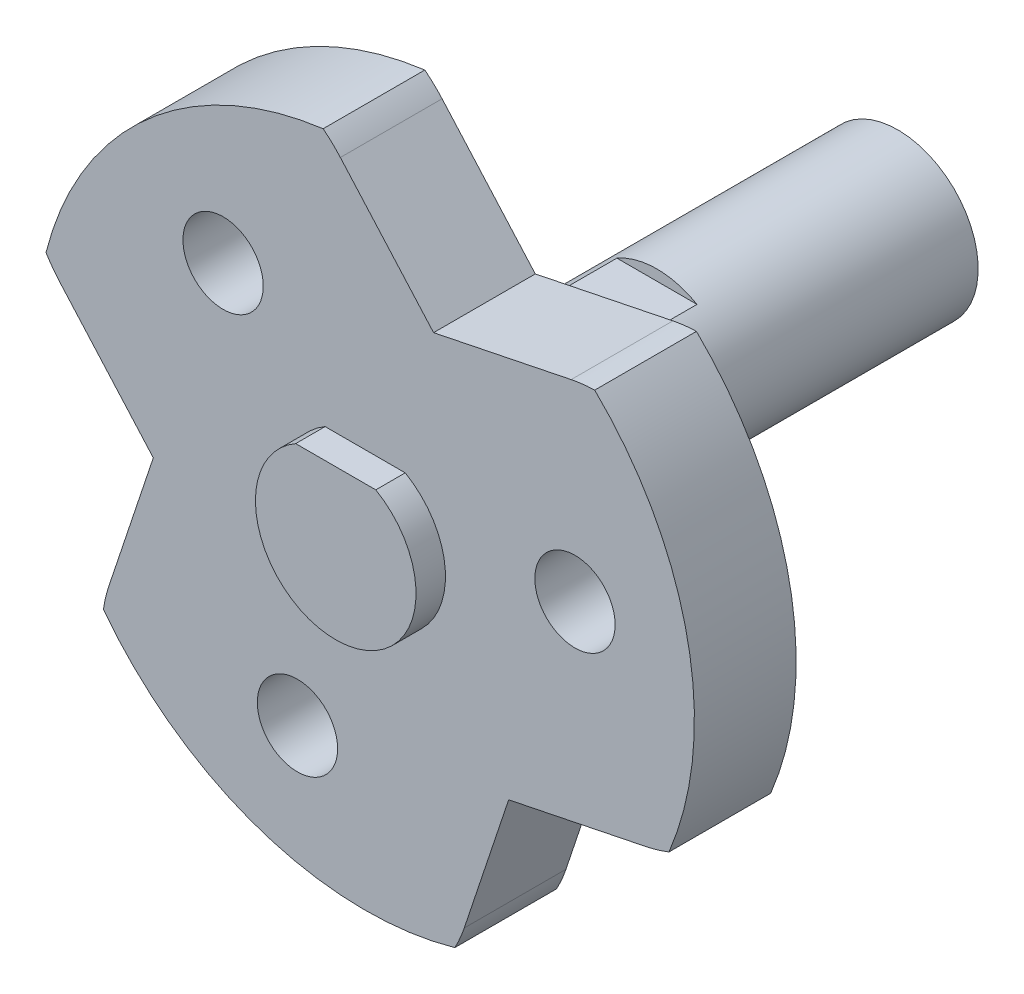
ISO-10303-21;
HEADER;
FILE_DESCRIPTION(('STEP AP214'),'2;1');
FILE_NAME('part.step','',(''),(''),'','','');
FILE_SCHEMA(('AUTOMOTIVE_DESIGN { 1 0 10303 214 1 1 1 1 }'));
ENDSEC;
DATA;
#1=APPLICATION_CONTEXT('core data for automotive mechanical design processes');
#2=APPLICATION_PROTOCOL_DEFINITION('international standard','automotive_design',2000,#1);
#3=PRODUCT_CONTEXT('',#1,'mechanical');
#4=PRODUCT('Part','Part','',(#3));
#5=PRODUCT_RELATED_PRODUCT_CATEGORY('part','',(#4));
#6=PRODUCT_DEFINITION_FORMATION('','',#4);
#7=PRODUCT_DEFINITION_CONTEXT('part definition',#1,'design');
#8=PRODUCT_DEFINITION('design','',#6,#7);
#9=PRODUCT_DEFINITION_SHAPE('','',#8);
#10=(LENGTH_UNIT() NAMED_UNIT(*) SI_UNIT(.MILLI.,.METRE.));
#11=(NAMED_UNIT(*) PLANE_ANGLE_UNIT() SI_UNIT($,.RADIAN.));
#12=(NAMED_UNIT(*) SI_UNIT($,.STERADIAN.) SOLID_ANGLE_UNIT());
#13=UNCERTAINTY_MEASURE_WITH_UNIT(LENGTH_MEASURE(1.E-05),#10,'distance_accuracy_value','');
#14=(GEOMETRIC_REPRESENTATION_CONTEXT(3) GLOBAL_UNCERTAINTY_ASSIGNED_CONTEXT((#13)) GLOBAL_UNIT_ASSIGNED_CONTEXT((#10,
#11,#12)) REPRESENTATION_CONTEXT('',''));
#15=CARTESIAN_POINT('',(0.,0.,0.));
#16=DIRECTION('',(0.,0.,1.));
#17=DIRECTION('',(1.,0.,0.));
#18=AXIS2_PLACEMENT_3D('',#15,#16,#17);
#19=CARTESIAN_POINT('',(0.,0.,7.1));
#20=DIRECTION('',(0.,0.,-1.));
#21=DIRECTION('',(-1.,0.,0.));
#22=AXIS2_PLACEMENT_3D('',#19,#20,#21);
#23=PLANE('',#22);
#24=CARTESIAN_POINT('',(0.,0.,7.1));
#25=DIRECTION('',(0.,0.,-1.));
#26=DIRECTION('',(-1.,0.,0.));
#27=AXIS2_PLACEMENT_3D('',#24,#25,#26);
#28=CIRCLE('',#27,12.3);
#29=CARTESIAN_POINT('',(-9.779576625406,-7.45988478649721,7.1));
#30=VERTEX_POINT('',#29);
#31=CARTESIAN_POINT('',(3.347730428427,-11.8356538044412,7.1));
#32=VERTEX_POINT('',#31);
#33=EDGE_CURVE('E277',#30,#32,#28,.F.);
#34=ORIENTED_EDGE('',*,*,#33,.F.);
#35=CARTESIAN_POINT('',(-4.8316412967905,-8.17956248091233,7.1));
#36=DIRECTION('',(0.,0.,-1.));
#37=DIRECTION('',(-1.,0.,0.));
#38=AXIS2_PLACEMENT_3D('',#35,#36,#37);
#39=CIRCLE('',#38,5.);
#40=CARTESIAN_POINT('',(-9.57505778704315,-6.59842365082837,7.1));
#41=VERTEX_POINT('',#40);
#42=EDGE_CURVE('E251',#30,#41,#39,.T.);
#43=ORIENTED_EDGE('',*,*,#42,.T.);
#44=DIRECTION('',(-0.316227766016791,-0.94868329805053,0.));
#45=VECTOR('',#44,1.);
#46=CARTESIAN_POINT('',(-6.63802491309086,2.21267497102993,7.1));
#47=LINE('',#46,#45);
#48=CARTESIAN_POINT('',(-7.91551340324403,-1.61979049943018,7.1));
#49=VERTEX_POINT('',#48);
#50=EDGE_CURVE('E227',#49,#41,#47,.T.);
#51=ORIENTED_EDGE('',*,*,#50,.F.);
#52=DIRECTION('',(0.663469953249336,-0.748202927777835,0.));
#53=VECTOR('',#52,1.);
#54=CARTESIAN_POINT('',(-5.23524519177543,-4.6423607201754,7.1));
#55=LINE('',#54,#53);
#56=CARTESIAN_POINT('',(-11.3973639965784,2.30673367134673,7.1));
#57=VERTEX_POINT('',#56);
#58=EDGE_CURVE('E178',#57,#49,#55,.T.);
#59=ORIENTED_EDGE('',*,*,#58,.F.);
#60=CARTESIAN_POINT('',(-7.65634935768918,5.62408343759341,7.1));
#61=DIRECTION('',(0.,0.,-1.));
#62=DIRECTION('',(-1.,0.,0.));
#63=AXIS2_PLACEMENT_3D('',#60,#61,#62);
#64=CIRCLE('',#63,5.);
#65=CARTESIAN_POINT('',(-11.9238420792575,3.01860730618072,7.1));
#66=VERTEX_POINT('',#65);
#67=EDGE_CURVE('E171',#57,#66,#64,.T.);
#68=ORIENTED_EDGE('',*,*,#67,.T.);
#69=CARTESIAN_POINT('',(0.,0.,7.1));
#70=DIRECTION('',(0.,0.,-1.));
#71=DIRECTION('',(-1.,0.,0.));
#72=AXIS2_PLACEMENT_3D('',#69,#70,#71);
#73=CIRCLE('',#72,12.3);
#74=CARTESIAN_POINT('',(-1.57066142170859,12.1993041891067,7.1));
#75=VERTEX_POINT('',#74);
#76=EDGE_CURVE('E155',#75,#66,#73,.F.);
#77=ORIENTED_EDGE('',*,*,#76,.F.);
#78=CARTESIAN_POINT('',(-4.66788825191685,8.27410534545075,7.1));
#79=DIRECTION('',(0.,0.,-1.));
#80=DIRECTION('',(-1.,0.,0.));
#81=AXIS2_PLACEMENT_3D('',#78,#79,#80);
#82=CIRCLE('',#81,5.);
#83=CARTESIAN_POINT('',(-0.926873613027803,11.5914551116976,7.1));
#84=VERTEX_POINT('',#83);
#85=EDGE_CURVE('E180',#75,#84,#82,.T.);
#86=ORIENTED_EDGE('',*,*,#85,.T.);
#87=DIRECTION('',(-0.663469953249364,0.74820292777781,0.));
#88=VECTOR('',#87,1.);
#89=CARTESIAN_POINT('',(5.23524519177537,4.64236072017569,7.1));
#90=LINE('',#89,#88);
#91=CARTESIAN_POINT('',(2.55497698030683,7.66493094092062,7.1));
#92=VERTEX_POINT('',#91);
#93=EDGE_CURVE('E236',#92,#84,#90,.T.);
#94=ORIENTED_EDGE('',*,*,#93,.F.);
#95=DIRECTION('',(-0.979697719266168,-0.200480370272676,0.));
#96=VECTOR('',#95,1.);
#97=CARTESIAN_POINT('',(-1.40277972131517,6.85503569120556,7.1));
#98=LINE('',#97,#96);
#99=CARTESIAN_POINT('',(7.69637195744043,8.71703992154159,7.1));
#100=VERTEX_POINT('',#99);
#101=EDGE_CURVE('E231',#100,#92,#98,.T.);
#102=ORIENTED_EDGE('',*,*,#101,.F.);
#103=CARTESIAN_POINT('',(8.69877380880382,3.81855132521075,7.1));
#104=DIRECTION('',(0.,0.,-1.));
#105=DIRECTION('',(-1.,0.,0.));
#106=AXIS2_PLACEMENT_3D('',#103,#104,#105);
#107=CIRCLE('',#106,5.);
#108=CARTESIAN_POINT('',(8.57611165083062,8.81704649826047,7.1));
#109=VERTEX_POINT('',#108);
#110=EDGE_CURVE('E185',#100,#109,#107,.T.);
#111=ORIENTED_EDGE('',*,*,#110,.T.);
#112=CARTESIAN_POINT('',(0.,0.,7.1));
#113=DIRECTION('',(0.,0.,-1.));
#114=DIRECTION('',(-1.,0.,0.));
#115=AXIS2_PLACEMENT_3D('',#112,#113,#114);
#116=CIRCLE('',#115,12.3);
#117=CARTESIAN_POINT('',(11.3502380471147,-4.73941940260943,7.1));
#118=VERTEX_POINT('',#117);
#119=EDGE_CURVE('E259',#118,#109,#116,.F.);
#120=ORIENTED_EDGE('',*,*,#119,.F.);
#121=CARTESIAN_POINT('',(9.49952954870739,-0.0945428645383554,7.1));
#122=DIRECTION('',(0.,0.,-1.));
#123=DIRECTION('',(-1.,0.,0.));
#124=AXIS2_PLACEMENT_3D('',#121,#122,#123);
#125=CIRCLE('',#124,5.);
#126=CARTESIAN_POINT('',(10.501931400071,-4.99303146086914,7.1));
#127=VERTEX_POINT('',#126);
#128=EDGE_CURVE('E256',#118,#127,#125,.T.);
#129=ORIENTED_EDGE('',*,*,#128,.T.);
#130=DIRECTION('',(0.979697719266157,0.200480370272727,0.));
#131=VECTOR('',#130,1.);
#132=CARTESIAN_POINT('',(1.40277972131555,-6.85503569120564,7.1));
#133=LINE('',#132,#131);
#134=CARTESIAN_POINT('',(5.36053642293725,-6.04514044149043,7.1));
#135=VERTEX_POINT('',#134);
#136=EDGE_CURVE('E226',#135,#127,#133,.T.);
#137=ORIENTED_EDGE('',*,*,#136,.F.);
#138=DIRECTION('',(0.316227766016827,0.948683298050518,0.));
#139=VECTOR('',#138,1.);
#140=CARTESIAN_POINT('',(6.63802491309064,-2.21267497103012,7.1));
#141=LINE('',#140,#139);
#142=CARTESIAN_POINT('',(3.70099203913802,-11.0237735928883,7.1));
#143=VERTEX_POINT('',#142);
#144=EDGE_CURVE('E240',#143,#135,#141,.T.);
#145=ORIENTED_EDGE('',*,*,#144,.F.);
#146=CARTESIAN_POINT('',(-1.04242445111457,-9.44263476280421,7.1));
#147=DIRECTION('',(0.,0.,-1.));
#148=DIRECTION('',(-1.,0.,0.));
#149=AXIS2_PLACEMENT_3D('',#146,#147,#148);
#150=CIRCLE('',#149,5.);
#151=EDGE_CURVE('E253',#143,#32,#150,.T.);
#152=ORIENTED_EDGE('',*,*,#151,.T.);
#153=EDGE_LOOP('',(#34,#43,#51,#59,#68,#77,#86,#94,#102,#111,#120,#129,#137,#145,#152));
#154=FACE_BOUND('',#153,.T.);
#155=CARTESIAN_POINT('',(0.,0.,7.1));
#156=DIRECTION('',(0.,0.,-1.));
#157=DIRECTION('',(-1.,0.,0.));
#158=AXIS2_PLACEMENT_3D('',#155,#156,#157);
#159=CIRCLE('',#158,2.25);
#160=CARTESIAN_POINT('',(-2.25,0.,7.1));
#161=VERTEX_POINT('',#160);
#162=EDGE_CURVE('E304',#161,#161,#159,.F.);
#163=ORIENTED_EDGE('',*,*,#162,.T.);
#164=EDGE_LOOP('',(#163));
#165=FACE_BOUND('',#164,.T.);
#166=CARTESIAN_POINT('',(-2.52982212813461,-7.58946638440414,7.1));
#167=DIRECTION('',(0.,0.,-1.));
#168=DIRECTION('',(-1.,0.,0.));
#169=AXIS2_PLACEMENT_3D('',#166,#167,#168);
#170=CIRCLE('',#169,1.5);
#171=CARTESIAN_POINT('',(-4.02982212813461,-7.58946638440414,7.1));
#172=VERTEX_POINT('',#171);
#173=EDGE_CURVE('E298',#172,#172,#170,.F.);
#174=ORIENTED_EDGE('',*,*,#173,.T.);
#175=EDGE_LOOP('',(#174));
#176=FACE_BOUND('',#175,.T.);
#177=CARTESIAN_POINT('',(7.83758175412945,1.60384296218185,7.1));
#178=DIRECTION('',(0.,0.,-1.));
#179=DIRECTION('',(-1.,0.,0.));
#180=AXIS2_PLACEMENT_3D('',#177,#178,#179);
#181=CIRCLE('',#180,1.5);
#182=CARTESIAN_POINT('',(6.33758175412945,1.60384296218185,7.1));
#183=VERTEX_POINT('',#182);
#184=EDGE_CURVE('E292',#183,#183,#181,.F.);
#185=ORIENTED_EDGE('',*,*,#184,.T.);
#186=EDGE_LOOP('',(#185));
#187=FACE_BOUND('',#186,.T.);
#188=CARTESIAN_POINT('',(-5.30775962599497,5.98562342222295,7.1));
#189=DIRECTION('',(0.,0.,-1.));
#190=DIRECTION('',(-1.,0.,0.));
#191=AXIS2_PLACEMENT_3D('',#188,#189,#190);
#192=CIRCLE('',#191,1.5);
#193=CARTESIAN_POINT('',(-6.80775962599497,5.98562342222295,7.1));
#194=VERTEX_POINT('',#193);
#195=EDGE_CURVE('E286',#194,#194,#192,.F.);
#196=ORIENTED_EDGE('',*,*,#195,.T.);
#197=EDGE_LOOP('',(#196));
#198=FACE_BOUND('',#197,.T.);
#199=ADVANCED_FACE('F49',(#154,#165,#176,#187,#198),#23,.T.);
#200=CARTESIAN_POINT('',(1.40277972131555,-6.85503569120564,-9.001));
#201=DIRECTION('',(0.200480370272727,-0.979697719266157,0.));
#202=DIRECTION('',(0.979697719266157,0.200480370272727,0.));
#203=AXIS2_PLACEMENT_3D('',#200,#201,#202);
#204=PLANE('',#203);
#205=DIRECTION('',(0.979697719266157,0.200480370272727,0.));
#206=VECTOR('',#205,1.);
#207=CARTESIAN_POINT('',(1.40277972131555,-6.85503569120564,10.9));
#208=LINE('',#207,#206);
#209=CARTESIAN_POINT('',(5.36053642293725,-6.04514044149043,10.9));
#210=VERTEX_POINT('',#209);
#211=CARTESIAN_POINT('',(10.501931400071,-4.99303146086914,10.9));
#212=VERTEX_POINT('',#211);
#213=EDGE_CURVE('E315',#210,#212,#208,.T.);
#214=ORIENTED_EDGE('',*,*,#213,.F.);
#215=DIRECTION('',(0.,0.,1.));
#216=VECTOR('',#215,1.);
#217=CARTESIAN_POINT('',(5.36053642293725,-6.04514044149043,-9.001));
#218=LINE('',#217,#216);
#219=EDGE_CURVE('E246',#135,#210,#218,.T.);
#220=ORIENTED_EDGE('',*,*,#219,.F.);
#221=ORIENTED_EDGE('',*,*,#136,.T.);
#222=DIRECTION('',(0.,0.,-1.));
#223=VECTOR('',#222,1.);
#224=CARTESIAN_POINT('',(10.501931400071,-4.99303146086914,-9.001));
#225=LINE('',#224,#223);
#226=EDGE_CURVE('E190',#127,#212,#225,.F.);
#227=ORIENTED_EDGE('',*,*,#226,.T.);
#228=EDGE_LOOP('',(#214,#220,#221,#227));
#229=FACE_BOUND('',#228,.T.);
#230=ADVANCED_FACE('F323',(#229),#204,.T.);
#231=CARTESIAN_POINT('',(6.63802491309064,-2.21267497103012,-9.001));
#232=DIRECTION('',(0.948683298050518,-0.316227766016827,0.));
#233=DIRECTION('',(0.316227766016827,0.948683298050518,0.));
#234=AXIS2_PLACEMENT_3D('',#231,#232,#233);
#235=PLANE('',#234);
#236=DIRECTION('',(0.316227766016827,0.948683298050518,0.));
#237=VECTOR('',#236,1.);
#238=CARTESIAN_POINT('',(6.63802491309064,-2.21267497103012,10.9));
#239=LINE('',#238,#237);
#240=CARTESIAN_POINT('',(3.70099203913802,-11.0237735928883,10.9));
#241=VERTEX_POINT('',#240);
#242=EDGE_CURVE('E313',#241,#210,#239,.T.);
#243=ORIENTED_EDGE('',*,*,#242,.F.);
#244=DIRECTION('',(0.,0.,-1.));
#245=VECTOR('',#244,1.);
#246=CARTESIAN_POINT('',(3.70099203913802,-11.0237735928883,-9.001));
#247=LINE('',#246,#245);
#248=EDGE_CURVE('E193',#241,#143,#247,.T.);
#249=ORIENTED_EDGE('',*,*,#248,.T.);
#250=ORIENTED_EDGE('',*,*,#144,.T.);
#251=ORIENTED_EDGE('',*,*,#219,.T.);
#252=EDGE_LOOP('',(#243,#249,#250,#251));
#253=FACE_BOUND('',#252,.T.);
#254=ADVANCED_FACE('F332',(#253),#235,.T.);
#255=CARTESIAN_POINT('',(5.23524519177537,4.64236072017569,-9.001));
#256=DIRECTION('',(0.74820292777781,0.663469953249364,0.));
#257=DIRECTION('',(-0.663469953249364,0.74820292777781,0.));
#258=AXIS2_PLACEMENT_3D('',#255,#256,#257);
#259=PLANE('',#258);
#260=DIRECTION('',(-0.663469953249364,0.74820292777781,0.));
#261=VECTOR('',#260,1.);
#262=CARTESIAN_POINT('',(5.23524519177537,4.64236072017569,10.9));
#263=LINE('',#262,#261);
#264=CARTESIAN_POINT('',(2.55497698030683,7.66493094092062,10.9));
#265=VERTEX_POINT('',#264);
#266=CARTESIAN_POINT('',(-0.926873613027803,11.5914551116976,10.9));
#267=VERTEX_POINT('',#266);
#268=EDGE_CURVE('E224',#265,#267,#263,.T.);
#269=ORIENTED_EDGE('',*,*,#268,.F.);
#270=DIRECTION('',(0.,0.,1.));
#271=VECTOR('',#270,1.);
#272=CARTESIAN_POINT('',(2.55497698030683,7.66493094092062,-9.001));
#273=LINE('',#272,#271);
#274=EDGE_CURVE('E239',#92,#265,#273,.T.);
#275=ORIENTED_EDGE('',*,*,#274,.F.);
#276=ORIENTED_EDGE('',*,*,#93,.T.);
#277=DIRECTION('',(0.,0.,-1.));
#278=VECTOR('',#277,1.);
#279=CARTESIAN_POINT('',(-0.926873613027802,11.5914551116976,-9.001));
#280=LINE('',#279,#278);
#281=EDGE_CURVE('E179',#84,#267,#280,.F.);
#282=ORIENTED_EDGE('',*,*,#281,.T.);
#283=EDGE_LOOP('',(#269,#275,#276,#282));
#284=FACE_BOUND('',#283,.T.);
#285=ADVANCED_FACE('F267',(#284),#259,.T.);
#286=CARTESIAN_POINT('',(-1.40277972131517,6.85503569120556,-9.001));
#287=DIRECTION('',(-0.200480370272676,0.979697719266168,0.));
#288=DIRECTION('',(-0.979697719266168,-0.200480370272676,0.));
#289=AXIS2_PLACEMENT_3D('',#286,#287,#288);
#290=PLANE('',#289);
#291=DIRECTION('',(-0.979697719266168,-0.200480370272676,0.));
#292=VECTOR('',#291,1.);
#293=CARTESIAN_POINT('',(-1.40277972131517,6.85503569120556,10.9));
#294=LINE('',#293,#292);
#295=CARTESIAN_POINT('',(7.69637195744043,8.71703992154159,10.9));
#296=VERTEX_POINT('',#295);
#297=EDGE_CURVE('E218',#296,#265,#294,.T.);
#298=ORIENTED_EDGE('',*,*,#297,.F.);
#299=DIRECTION('',(0.,0.,-1.));
#300=VECTOR('',#299,1.);
#301=CARTESIAN_POINT('',(7.69637195744043,8.71703992154159,-9.001));
#302=LINE('',#301,#300);
#303=EDGE_CURVE('E183',#296,#100,#302,.T.);
#304=ORIENTED_EDGE('',*,*,#303,.T.);
#305=ORIENTED_EDGE('',*,*,#101,.T.);
#306=ORIENTED_EDGE('',*,*,#274,.T.);
#307=EDGE_LOOP('',(#298,#304,#305,#306));
#308=FACE_BOUND('',#307,.T.);
#309=ADVANCED_FACE('F264',(#308),#290,.T.);
#310=CARTESIAN_POINT('',(-6.63802491309086,2.21267497102993,-9.001));
#311=DIRECTION('',(-0.948683298050529,0.316227766016791,0.));
#312=DIRECTION('',(-0.316227766016791,-0.94868329805053,0.));
#313=AXIS2_PLACEMENT_3D('',#310,#311,#312);
#314=PLANE('',#313);
#315=DIRECTION('',(-0.316227766016791,-0.94868329805053,0.));
#316=VECTOR('',#315,1.);
#317=CARTESIAN_POINT('',(-6.63802491309086,2.21267497102993,10.9));
#318=LINE('',#317,#316);
#319=CARTESIAN_POINT('',(-7.91551340324402,-1.61979049943018,10.9));
#320=VERTEX_POINT('',#319);
#321=CARTESIAN_POINT('',(-9.57505778704315,-6.59842365082837,10.9));
#322=VERTEX_POINT('',#321);
#323=EDGE_CURVE('E307',#320,#322,#318,.T.);
#324=ORIENTED_EDGE('',*,*,#323,.F.);
#325=DIRECTION('',(0.,0.,1.));
#326=VECTOR('',#325,1.);
#327=CARTESIAN_POINT('',(-7.91551340324402,-1.61979049943018,-9.001));
#328=LINE('',#327,#326);
#329=EDGE_CURVE('E230',#49,#320,#328,.T.);
#330=ORIENTED_EDGE('',*,*,#329,.F.);
#331=ORIENTED_EDGE('',*,*,#50,.T.);
#332=DIRECTION('',(0.,0.,-1.));
#333=VECTOR('',#332,1.);
#334=CARTESIAN_POINT('',(-9.57505778704315,-6.59842365082837,-9.001));
#335=LINE('',#334,#333);
#336=EDGE_CURVE('E195',#41,#322,#335,.F.);
#337=ORIENTED_EDGE('',*,*,#336,.T.);
#338=EDGE_LOOP('',(#324,#330,#331,#337));
#339=FACE_BOUND('',#338,.T.);
#340=ADVANCED_FACE('F372',(#339),#314,.T.);
#341=CARTESIAN_POINT('',(-5.23524519177543,-4.6423607201754,-9.001));
#342=DIRECTION('',(-0.748202927777835,-0.663469953249336,0.));
#343=DIRECTION('',(0.663469953249336,-0.748202927777835,0.));
#344=AXIS2_PLACEMENT_3D('',#341,#342,#343);
#345=PLANE('',#344);
#346=DIRECTION('',(0.663469953249336,-0.748202927777835,0.));
#347=VECTOR('',#346,1.);
#348=CARTESIAN_POINT('',(-5.23524519177543,-4.6423607201754,10.9));
#349=LINE('',#348,#347);
#350=CARTESIAN_POINT('',(-11.3973639965784,2.30673367134673,10.9));
#351=VERTEX_POINT('',#350);
#352=EDGE_CURVE('E311',#351,#320,#349,.T.);
#353=ORIENTED_EDGE('',*,*,#352,.F.);
#354=DIRECTION('',(0.,0.,-1.));
#355=VECTOR('',#354,1.);
#356=CARTESIAN_POINT('',(-11.3973639965784,2.30673367134673,-9.001));
#357=LINE('',#356,#355);
#358=EDGE_CURVE('E235',#351,#57,#357,.T.);
#359=ORIENTED_EDGE('',*,*,#358,.T.);
#360=ORIENTED_EDGE('',*,*,#58,.T.);
#361=ORIENTED_EDGE('',*,*,#329,.T.);
#362=EDGE_LOOP('',(#353,#359,#360,#361));
#363=FACE_BOUND('',#362,.T.);
#364=ADVANCED_FACE('F349',(#363),#345,.T.);
#365=CARTESIAN_POINT('',(-7.65634935768918,5.62408343759341,12.));
#366=DIRECTION('',(0.,0.,-1.));
#367=DIRECTION('',(-1.,0.,0.));
#368=AXIS2_PLACEMENT_3D('',#365,#366,#367);
#369=CYLINDRICAL_SURFACE('',#368,5.);
#370=DIRECTION('',(0.,0.,-1.));
#371=VECTOR('',#370,1.);
#372=CARTESIAN_POINT('',(-11.9238420792575,3.01860730618072,9.));
#373=LINE('',#372,#371);
#374=CARTESIAN_POINT('',(-11.9238420792575,3.01860730618072,10.9));
#375=VERTEX_POINT('',#374);
#376=EDGE_CURVE('E158',#66,#375,#373,.F.);
#377=ORIENTED_EDGE('',*,*,#376,.F.);
#378=ORIENTED_EDGE('',*,*,#67,.F.);
#379=ORIENTED_EDGE('',*,*,#358,.F.);
#380=CARTESIAN_POINT('',(-7.65634935768918,5.62408343759341,10.9));
#381=DIRECTION('',(0.,0.,-1.));
#382=DIRECTION('',(-1.,0.,0.));
#383=AXIS2_PLACEMENT_3D('',#380,#381,#382);
#384=CIRCLE('',#383,5.);
#385=EDGE_CURVE('E172',#375,#351,#384,.F.);
#386=ORIENTED_EDGE('',*,*,#385,.F.);
#387=EDGE_LOOP('',(#377,#378,#379,#386));
#388=FACE_BOUND('',#387,.T.);
#389=ADVANCED_FACE('F169',(#388),#369,.T.);
#390=CARTESIAN_POINT('',(-4.66788825191685,8.27410534545075,12.));
#391=DIRECTION('',(0.,0.,-1.));
#392=DIRECTION('',(-1.,0.,0.));
#393=AXIS2_PLACEMENT_3D('',#390,#391,#392);
#394=CYLINDRICAL_SURFACE('',#393,5.);
#395=DIRECTION('',(0.,0.,-1.));
#396=VECTOR('',#395,1.);
#397=CARTESIAN_POINT('',(-1.57066142170859,12.1993041891067,9.));
#398=LINE('',#397,#396);
#399=CARTESIAN_POINT('',(-1.57066142170858,12.1993041891067,10.9));
#400=VERTEX_POINT('',#399);
#401=EDGE_CURVE('E161',#400,#75,#398,.T.);
#402=ORIENTED_EDGE('',*,*,#401,.F.);
#403=CARTESIAN_POINT('',(-4.66788825191685,8.27410534545075,10.9));
#404=DIRECTION('',(0.,0.,-1.));
#405=DIRECTION('',(-1.,0.,0.));
#406=AXIS2_PLACEMENT_3D('',#403,#404,#405);
#407=CIRCLE('',#406,5.);
#408=EDGE_CURVE('E216',#267,#400,#407,.F.);
#409=ORIENTED_EDGE('',*,*,#408,.F.);
#410=ORIENTED_EDGE('',*,*,#281,.F.);
#411=ORIENTED_EDGE('',*,*,#85,.F.);
#412=EDGE_LOOP('',(#402,#409,#410,#411));
#413=FACE_BOUND('',#412,.T.);
#414=ADVANCED_FACE('F271',(#413),#394,.T.);
#415=CARTESIAN_POINT('',(8.69877380880382,3.81855132521075,12.));
#416=DIRECTION('',(0.,0.,-1.));
#417=DIRECTION('',(-1.,0.,0.));
#418=AXIS2_PLACEMENT_3D('',#415,#416,#417);
#419=CYLINDRICAL_SURFACE('',#418,5.);
#420=DIRECTION('',(0.,0.,-1.));
#421=VECTOR('',#420,1.);
#422=CARTESIAN_POINT('',(8.57611165083062,8.81704649826047,9.));
#423=LINE('',#422,#421);
#424=CARTESIAN_POINT('',(8.57611165083062,8.81704649826047,10.9));
#425=VERTEX_POINT('',#424);
#426=EDGE_CURVE('E65',#109,#425,#423,.F.);
#427=ORIENTED_EDGE('',*,*,#426,.F.);
#428=ORIENTED_EDGE('',*,*,#110,.F.);
#429=ORIENTED_EDGE('',*,*,#303,.F.);
#430=CARTESIAN_POINT('',(8.69877380880382,3.81855132521075,10.9));
#431=DIRECTION('',(0.,0.,-1.));
#432=DIRECTION('',(-1.,0.,0.));
#433=AXIS2_PLACEMENT_3D('',#430,#431,#432);
#434=CIRCLE('',#433,5.);
#435=EDGE_CURVE('E206',#425,#296,#434,.F.);
#436=ORIENTED_EDGE('',*,*,#435,.F.);
#437=EDGE_LOOP('',(#427,#428,#429,#436));
#438=FACE_BOUND('',#437,.T.);
#439=ADVANCED_FACE('F213',(#438),#419,.T.);
#440=CARTESIAN_POINT('',(9.49952954870739,-0.0945428645383554,12.));
#441=DIRECTION('',(0.,0.,-1.));
#442=DIRECTION('',(-1.,0.,0.));
#443=AXIS2_PLACEMENT_3D('',#440,#441,#442);
#444=CYLINDRICAL_SURFACE('',#443,5.);
#445=DIRECTION('',(0.,0.,-1.));
#446=VECTOR('',#445,1.);
#447=CARTESIAN_POINT('',(11.3502380471147,-4.73941940260943,9.));
#448=LINE('',#447,#446);
#449=CARTESIAN_POINT('',(11.3502380471147,-4.73941940260943,10.9));
#450=VERTEX_POINT('',#449);
#451=EDGE_CURVE('E279',#450,#118,#448,.T.);
#452=ORIENTED_EDGE('',*,*,#451,.F.);
#453=CARTESIAN_POINT('',(9.49952954870739,-0.0945428645383554,10.9));
#454=DIRECTION('',(0.,0.,-1.));
#455=DIRECTION('',(-1.,0.,0.));
#456=AXIS2_PLACEMENT_3D('',#453,#454,#455);
#457=CIRCLE('',#456,5.);
#458=EDGE_CURVE('E209',#212,#450,#457,.F.);
#459=ORIENTED_EDGE('',*,*,#458,.F.);
#460=ORIENTED_EDGE('',*,*,#226,.F.);
#461=ORIENTED_EDGE('',*,*,#128,.F.);
#462=EDGE_LOOP('',(#452,#459,#460,#461));
#463=FACE_BOUND('',#462,.T.);
#464=ADVANCED_FACE('F322',(#463),#444,.T.);
#465=CARTESIAN_POINT('',(-1.04242445111457,-9.44263476280421,12.));
#466=DIRECTION('',(0.,0.,-1.));
#467=DIRECTION('',(-1.,0.,0.));
#468=AXIS2_PLACEMENT_3D('',#465,#466,#467);
#469=CYLINDRICAL_SURFACE('',#468,5.);
#470=DIRECTION('',(0.,0.,-1.));
#471=VECTOR('',#470,1.);
#472=CARTESIAN_POINT('',(3.347730428427,-11.8356538044412,9.));
#473=LINE('',#472,#471);
#474=CARTESIAN_POINT('',(3.347730428427,-11.8356538044412,10.9));
#475=VERTEX_POINT('',#474);
#476=EDGE_CURVE('E73',#32,#475,#473,.F.);
#477=ORIENTED_EDGE('',*,*,#476,.F.);
#478=ORIENTED_EDGE('',*,*,#151,.F.);
#479=ORIENTED_EDGE('',*,*,#248,.F.);
#480=CARTESIAN_POINT('',(-1.04242445111457,-9.44263476280421,10.9));
#481=DIRECTION('',(0.,0.,-1.));
#482=DIRECTION('',(-1.,0.,0.));
#483=AXIS2_PLACEMENT_3D('',#480,#481,#482);
#484=CIRCLE('',#483,5.);
#485=EDGE_CURVE('E309',#475,#241,#484,.F.);
#486=ORIENTED_EDGE('',*,*,#485,.F.);
#487=EDGE_LOOP('',(#477,#478,#479,#486));
#488=FACE_BOUND('',#487,.T.);
#489=ADVANCED_FACE('F330',(#488),#469,.T.);
#490=CARTESIAN_POINT('',(-4.8316412967905,-8.17956248091233,12.));
#491=DIRECTION('',(0.,0.,-1.));
#492=DIRECTION('',(-1.,0.,0.));
#493=AXIS2_PLACEMENT_3D('',#490,#491,#492);
#494=CYLINDRICAL_SURFACE('',#493,5.);
#495=DIRECTION('',(0.,0.,-1.));
#496=VECTOR('',#495,1.);
#497=CARTESIAN_POINT('',(-9.779576625406,-7.45988478649721,9.));
#498=LINE('',#497,#496);
#499=CARTESIAN_POINT('',(-9.779576625406,-7.45988478649721,10.9));
#500=VERTEX_POINT('',#499);
#501=EDGE_CURVE('E273',#500,#30,#498,.T.);
#502=ORIENTED_EDGE('',*,*,#501,.F.);
#503=CARTESIAN_POINT('',(-4.8316412967905,-8.17956248091233,10.9));
#504=DIRECTION('',(0.,0.,-1.));
#505=DIRECTION('',(-1.,0.,0.));
#506=AXIS2_PLACEMENT_3D('',#503,#504,#505);
#507=CIRCLE('',#506,5.);
#508=EDGE_CURVE('E197',#322,#500,#507,.F.);
#509=ORIENTED_EDGE('',*,*,#508,.F.);
#510=ORIENTED_EDGE('',*,*,#336,.F.);
#511=ORIENTED_EDGE('',*,*,#42,.F.);
#512=EDGE_LOOP('',(#502,#509,#510,#511));
#513=FACE_BOUND('',#512,.T.);
#514=ADVANCED_FACE('F51',(#513),#494,.T.);
#515=CARTESIAN_POINT('',(0.,0.,10.9));
#516=DIRECTION('',(0.,0.,-1.));
#517=DIRECTION('',(-1.,0.,0.));
#518=AXIS2_PLACEMENT_3D('',#515,#516,#517);
#519=PLANE('',#518);
#520=ORIENTED_EDGE('',*,*,#508,.T.);
#521=CARTESIAN_POINT('',(0.,0.,10.9));
#522=DIRECTION('',(0.,0.,-1.));
#523=DIRECTION('',(-1.,0.,0.));
#524=AXIS2_PLACEMENT_3D('',#521,#522,#523);
#525=CIRCLE('',#524,12.3);
#526=EDGE_CURVE('E12',#500,#475,#525,.F.);
#527=ORIENTED_EDGE('',*,*,#526,.T.);
#528=ORIENTED_EDGE('',*,*,#485,.T.);
#529=ORIENTED_EDGE('',*,*,#242,.T.);
#530=ORIENTED_EDGE('',*,*,#213,.T.);
#531=ORIENTED_EDGE('',*,*,#458,.T.);
#532=EDGE_CURVE('E58',#450,#425,#525,.F.);
#533=ORIENTED_EDGE('',*,*,#532,.T.);
#534=ORIENTED_EDGE('',*,*,#435,.T.);
#535=ORIENTED_EDGE('',*,*,#297,.T.);
#536=ORIENTED_EDGE('',*,*,#268,.T.);
#537=ORIENTED_EDGE('',*,*,#408,.T.);
#538=EDGE_CURVE('E53',#400,#375,#525,.F.);
#539=ORIENTED_EDGE('',*,*,#538,.T.);
#540=ORIENTED_EDGE('',*,*,#385,.T.);
#541=ORIENTED_EDGE('',*,*,#352,.T.);
#542=ORIENTED_EDGE('',*,*,#323,.T.);
#543=EDGE_LOOP('',(#520,#527,#528,#529,#530,#531,#533,#534,#535,#536,#537,#539,#540,#541,#542));
#544=FACE_BOUND('',#543,.T.);
#545=CARTESIAN_POINT('',(0.,0.,10.9));
#546=DIRECTION('',(0.,0.,1.));
#547=DIRECTION('',(1.,0.,0.));
#548=AXIS2_PLACEMENT_3D('',#545,#546,#547);
#549=CIRCLE('',#548,2.25);
#550=CARTESIAN_POINT('',(2.25,0.,10.9));
#551=VERTEX_POINT('',#550);
#552=EDGE_CURVE('E301',#551,#551,#549,.T.);
#553=ORIENTED_EDGE('',*,*,#552,.F.);
#554=EDGE_LOOP('',(#553));
#555=FACE_BOUND('',#554,.T.);
#556=CARTESIAN_POINT('',(-2.52982212813461,-7.58946638440414,10.9));
#557=DIRECTION('',(0.,0.,1.));
#558=DIRECTION('',(1.,0.,0.));
#559=AXIS2_PLACEMENT_3D('',#556,#557,#558);
#560=CIRCLE('',#559,1.5);
#561=CARTESIAN_POINT('',(-1.02982212813461,-7.58946638440414,10.9));
#562=VERTEX_POINT('',#561);
#563=EDGE_CURVE('E295',#562,#562,#560,.T.);
#564=ORIENTED_EDGE('',*,*,#563,.F.);
#565=EDGE_LOOP('',(#564));
#566=FACE_BOUND('',#565,.T.);
#567=CARTESIAN_POINT('',(7.83758175412945,1.60384296218185,10.9));
#568=DIRECTION('',(0.,0.,1.));
#569=DIRECTION('',(1.,0.,0.));
#570=AXIS2_PLACEMENT_3D('',#567,#568,#569);
#571=CIRCLE('',#570,1.5);
#572=CARTESIAN_POINT('',(9.33758175412945,1.60384296218185,10.9));
#573=VERTEX_POINT('',#572);
#574=EDGE_CURVE('E289',#573,#573,#571,.T.);
#575=ORIENTED_EDGE('',*,*,#574,.F.);
#576=EDGE_LOOP('',(#575));
#577=FACE_BOUND('',#576,.T.);
#578=CARTESIAN_POINT('',(-5.30775962599497,5.98562342222295,10.9));
#579=DIRECTION('',(0.,0.,1.));
#580=DIRECTION('',(1.,0.,0.));
#581=AXIS2_PLACEMENT_3D('',#578,#579,#580);
#582=CIRCLE('',#581,1.5);
#583=CARTESIAN_POINT('',(-3.80775962599497,5.98562342222295,10.9));
#584=VERTEX_POINT('',#583);
#585=EDGE_CURVE('E283',#584,#584,#582,.T.);
#586=ORIENTED_EDGE('',*,*,#585,.F.);
#587=EDGE_LOOP('',(#586));
#588=FACE_BOUND('',#587,.T.);
#589=ADVANCED_FACE('F204',(#544,#555,#566,#577,#588),#519,.F.);
#590=CARTESIAN_POINT('',(0.,0.,-1.95096679918781));
#591=DIRECTION('',(0.,0.,1.));
#592=DIRECTION('',(1.,0.,0.));
#593=AXIS2_PLACEMENT_3D('',#590,#591,#592);
#594=CYLINDRICAL_SURFACE('',#593,2.25);
#595=ORIENTED_EDGE('',*,*,#552,.T.);
#596=EDGE_LOOP('',(#595));
#597=FACE_BOUND('',#596,.T.);
#598=ORIENTED_EDGE('',*,*,#162,.F.);
#599=EDGE_LOOP('',(#598));
#600=FACE_BOUND('',#599,.T.);
#601=ADVANCED_FACE('F363',(#597,#600),#594,.F.);
#602=CARTESIAN_POINT('',(-2.52982212813461,-7.58946638440414,-1.95096679918781));
#603=DIRECTION('',(0.,0.,1.));
#604=DIRECTION('',(1.,0.,0.));
#605=AXIS2_PLACEMENT_3D('',#602,#603,#604);
#606=CYLINDRICAL_SURFACE('',#605,1.5);
#607=ORIENTED_EDGE('',*,*,#563,.T.);
#608=EDGE_LOOP('',(#607));
#609=FACE_BOUND('',#608,.T.);
#610=ORIENTED_EDGE('',*,*,#173,.F.);
#611=EDGE_LOOP('',(#610));
#612=FACE_BOUND('',#611,.T.);
#613=ADVANCED_FACE('F452',(#609,#612),#606,.F.);
#614=CARTESIAN_POINT('',(7.83758175412945,1.60384296218185,-1.95096679918781));
#615=DIRECTION('',(0.,0.,1.));
#616=DIRECTION('',(1.,0.,0.));
#617=AXIS2_PLACEMENT_3D('',#614,#615,#616);
#618=CYLINDRICAL_SURFACE('',#617,1.5);
#619=ORIENTED_EDGE('',*,*,#574,.T.);
#620=EDGE_LOOP('',(#619));
#621=FACE_BOUND('',#620,.T.);
#622=ORIENTED_EDGE('',*,*,#184,.F.);
#623=EDGE_LOOP('',(#622));
#624=FACE_BOUND('',#623,.T.);
#625=ADVANCED_FACE('F458',(#621,#624),#618,.F.);
#626=CARTESIAN_POINT('',(-5.30775962599497,5.98562342222295,-1.95096679918781));
#627=DIRECTION('',(0.,0.,1.));
#628=DIRECTION('',(1.,0.,0.));
#629=AXIS2_PLACEMENT_3D('',#626,#627,#628);
#630=CYLINDRICAL_SURFACE('',#629,1.5);
#631=ORIENTED_EDGE('',*,*,#585,.T.);
#632=EDGE_LOOP('',(#631));
#633=FACE_BOUND('',#632,.T.);
#634=ORIENTED_EDGE('',*,*,#195,.F.);
#635=EDGE_LOOP('',(#634));
#636=FACE_BOUND('',#635,.T.);
#637=ADVANCED_FACE('F466',(#633,#636),#630,.F.);
#638=CARTESIAN_POINT('',(0.,0.,12.));
#639=DIRECTION('',(0.,0.,-1.));
#640=DIRECTION('',(-1.,0.,0.));
#641=AXIS2_PLACEMENT_3D('',#638,#639,#640);
#642=CYLINDRICAL_SURFACE('',#641,12.3);
#643=ORIENTED_EDGE('',*,*,#401,.T.);
#644=ORIENTED_EDGE('',*,*,#76,.T.);
#645=ORIENTED_EDGE('',*,*,#376,.T.);
#646=ORIENTED_EDGE('',*,*,#538,.F.);
#647=EDGE_LOOP('',(#643,#644,#645,#646));
#648=FACE_BOUND('',#647,.T.);
#649=ADVANCED_FACE('F157',(#648),#642,.T.);
#650=ORIENTED_EDGE('',*,*,#451,.T.);
#651=ORIENTED_EDGE('',*,*,#119,.T.);
#652=ORIENTED_EDGE('',*,*,#426,.T.);
#653=ORIENTED_EDGE('',*,*,#532,.F.);
#654=EDGE_LOOP('',(#650,#651,#652,#653));
#655=FACE_BOUND('',#654,.T.);
#656=ADVANCED_FACE('F479',(#655),#642,.T.);
#657=ORIENTED_EDGE('',*,*,#501,.T.);
#658=ORIENTED_EDGE('',*,*,#33,.T.);
#659=ORIENTED_EDGE('',*,*,#476,.T.);
#660=ORIENTED_EDGE('',*,*,#526,.F.);
#661=EDGE_LOOP('',(#657,#658,#659,#660));
#662=FACE_BOUND('',#661,.T.);
#663=ADVANCED_FACE('F368',(#662),#642,.T.);
#664=CLOSED_SHELL('',(#199,#230,#254,#285,#309,#340,#364,#389,#414,#439,#464,#489,#514,#589,
#601,#613,#625,#637,#649,#656,#663));
#665=MANIFOLD_SOLID_BREP('B2',#664);
#666=CARTESIAN_POINT('',(0.,0.,12.));
#667=DIRECTION('',(0.,0.,-1.));
#668=DIRECTION('',(-1.,0.,0.));
#669=AXIS2_PLACEMENT_3D('',#666,#667,#668);
#670=CYLINDRICAL_SURFACE('',#669,3.);
#671=DIRECTION('',(0.,0.,-1.));
#672=VECTOR('',#671,1.);
#673=CARTESIAN_POINT('',(-1.49666295470958,2.6,12.));
#674=LINE('',#673,#672);
#675=CARTESIAN_POINT('',(-1.49666295470958,2.6,12.));
#676=VERTEX_POINT('',#675);
#677=CARTESIAN_POINT('',(-1.49666295470958,2.6,0.));
#678=VERTEX_POINT('',#677);
#679=EDGE_CURVE('E570',#676,#678,#674,.T.);
#680=ORIENTED_EDGE('',*,*,#679,.T.);
#681=CARTESIAN_POINT('',(0.,0.,0.));
#682=DIRECTION('',(0.,0.,-1.));
#683=DIRECTION('',(-1.,0.,0.));
#684=AXIS2_PLACEMENT_3D('',#681,#682,#683);
#685=CIRCLE('',#684,3.);
#686=CARTESIAN_POINT('',(1.49666295470958,2.6,0.));
#687=VERTEX_POINT('',#686);
#688=EDGE_CURVE('E588',#678,#687,#685,.T.);
#689=ORIENTED_EDGE('',*,*,#688,.T.);
#690=DIRECTION('',(0.,0.,-1.));
#691=VECTOR('',#690,1.);
#692=CARTESIAN_POINT('',(1.49666295470958,2.6,12.));
#693=LINE('',#692,#691);
#694=CARTESIAN_POINT('',(1.49666295470958,2.6,12.));
#695=VERTEX_POINT('',#694);
#696=EDGE_CURVE('E47',#695,#687,#693,.T.);
#697=ORIENTED_EDGE('',*,*,#696,.F.);
#698=CARTESIAN_POINT('',(0.,0.,12.));
#699=DIRECTION('',(0.,0.,1.));
#700=DIRECTION('',(1.,0.,0.));
#701=AXIS2_PLACEMENT_3D('',#698,#699,#700);
#702=CIRCLE('',#701,3.);
#703=EDGE_CURVE('E589',#676,#695,#702,.T.);
#704=ORIENTED_EDGE('',*,*,#703,.F.);
#705=EDGE_LOOP('',(#680,#689,#697,#704));
#706=FACE_BOUND('',#705,.T.);
#707=CARTESIAN_POINT('',(0.,0.,-9.));
#708=DIRECTION('',(0.,0.,-1.));
#709=DIRECTION('',(-1.,0.,0.));
#710=AXIS2_PLACEMENT_3D('',#707,#708,#709);
#711=CIRCLE('',#710,3.);
#712=CARTESIAN_POINT('',(-3.,0.,-9.));
#713=VERTEX_POINT('',#712);
#714=EDGE_CURVE('E595',#713,#713,#711,.T.);
#715=ORIENTED_EDGE('',*,*,#714,.F.);
#716=EDGE_LOOP('',(#715));
#717=FACE_BOUND('',#716,.T.);
#718=ADVANCED_FACE('F562',(#706,#717),#670,.T.);
#719=CARTESIAN_POINT('',(-1.49666295470958,2.6,12.));
#720=DIRECTION('',(0.,1.,0.));
#721=DIRECTION('',(0.,0.,1.));
#722=AXIS2_PLACEMENT_3D('',#719,#720,#721);
#723=PLANE('',#722);
#724=DIRECTION('',(1.,0.,0.));
#725=VECTOR('',#724,1.);
#726=CARTESIAN_POINT('',(-1.49666295470958,2.6,0.));
#727=LINE('',#726,#725);
#728=EDGE_CURVE('E592',#678,#687,#727,.T.);
#729=ORIENTED_EDGE('',*,*,#728,.F.);
#730=ORIENTED_EDGE('',*,*,#679,.F.);
#731=DIRECTION('',(1.,0.,0.));
#732=VECTOR('',#731,1.);
#733=CARTESIAN_POINT('',(-1.49666295470958,2.6,12.));
#734=LINE('',#733,#732);
#735=EDGE_CURVE('E591',#676,#695,#734,.T.);
#736=ORIENTED_EDGE('',*,*,#735,.T.);
#737=ORIENTED_EDGE('',*,*,#696,.T.);
#738=EDGE_LOOP('',(#729,#730,#736,#737));
#739=FACE_BOUND('',#738,.T.);
#740=ADVANCED_FACE('F593',(#739),#723,.T.);
#741=CARTESIAN_POINT('',(0.,0.,12.));
#742=DIRECTION('',(0.,0.,1.));
#743=DIRECTION('',(1.,0.,0.));
#744=AXIS2_PLACEMENT_3D('',#741,#742,#743);
#745=PLANE('',#744);
#746=ORIENTED_EDGE('',*,*,#703,.T.);
#747=ORIENTED_EDGE('',*,*,#735,.F.);
#748=EDGE_LOOP('',(#746,#747));
#749=FACE_BOUND('',#748,.T.);
#750=ADVANCED_FACE('F604',(#749),#745,.T.);
#751=CARTESIAN_POINT('',(0.,0.,0.));
#752=DIRECTION('',(0.,0.,-1.));
#753=DIRECTION('',(-1.,0.,0.));
#754=AXIS2_PLACEMENT_3D('',#751,#752,#753);
#755=PLANE('',#754);
#756=ORIENTED_EDGE('',*,*,#688,.F.);
#757=ORIENTED_EDGE('',*,*,#728,.T.);
#758=EDGE_LOOP('',(#756,#757));
#759=FACE_BOUND('',#758,.T.);
#760=ADVANCED_FACE('F597',(#759),#755,.F.);
#761=CARTESIAN_POINT('',(0.,0.,-9.));
#762=DIRECTION('',(0.,0.,-1.));
#763=DIRECTION('',(-1.,0.,0.));
#764=AXIS2_PLACEMENT_3D('',#761,#762,#763);
#765=PLANE('',#764);
#766=ORIENTED_EDGE('',*,*,#714,.T.);
#767=EDGE_LOOP('',(#766));
#768=FACE_BOUND('',#767,.T.);
#769=ADVANCED_FACE('F611',(#768),#765,.T.);
#770=CLOSED_SHELL('',(#718,#740,#750,#760,#769));
#771=MANIFOLD_SOLID_BREP('B6_NOT_SHOWN',#770);
#772=ADVANCED_BREP_SHAPE_REPRESENTATION('',(#18,#665,#771),#14);
#773=SHAPE_DEFINITION_REPRESENTATION(#9,#772);
ENDSEC;
END-ISO-10303-21;
